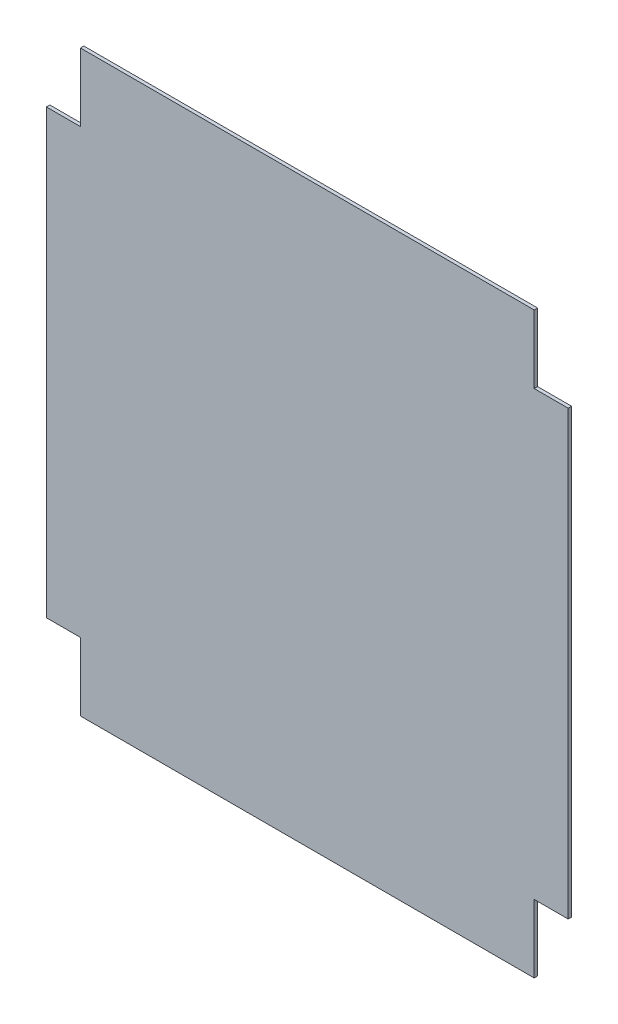
ISO-10303-21;
HEADER;
FILE_DESCRIPTION(('STEP AP214'),'2;1');
FILE_NAME('part.step','',(''),(''),'','','');
FILE_SCHEMA(('AUTOMOTIVE_DESIGN { 1 0 10303 214 1 1 1 1 }'));
ENDSEC;
DATA;
#1=APPLICATION_CONTEXT('core data for automotive mechanical design processes');
#2=APPLICATION_PROTOCOL_DEFINITION('international standard','automotive_design',2000,#1);
#3=PRODUCT_CONTEXT('',#1,'mechanical');
#4=PRODUCT('Part','Part','',(#3));
#5=PRODUCT_RELATED_PRODUCT_CATEGORY('part','',(#4));
#6=PRODUCT_DEFINITION_FORMATION('','',#4);
#7=PRODUCT_DEFINITION_CONTEXT('part definition',#1,'design');
#8=PRODUCT_DEFINITION('design','',#6,#7);
#9=PRODUCT_DEFINITION_SHAPE('','',#8);
#10=(LENGTH_UNIT() NAMED_UNIT(*) SI_UNIT(.MILLI.,.METRE.));
#11=(NAMED_UNIT(*) PLANE_ANGLE_UNIT() SI_UNIT($,.RADIAN.));
#12=(NAMED_UNIT(*) SI_UNIT($,.STERADIAN.) SOLID_ANGLE_UNIT());
#13=UNCERTAINTY_MEASURE_WITH_UNIT(LENGTH_MEASURE(1.E-05),#10,'distance_accuracy_value','');
#14=(GEOMETRIC_REPRESENTATION_CONTEXT(3) GLOBAL_UNCERTAINTY_ASSIGNED_CONTEXT((#13)) GLOBAL_UNIT_ASSIGNED_CONTEXT((#10,
#11,#12)) REPRESENTATION_CONTEXT('',''));
#15=CARTESIAN_POINT('',(0.,0.,0.));
#16=DIRECTION('',(0.,0.,1.));
#17=DIRECTION('',(1.,0.,0.));
#18=AXIS2_PLACEMENT_3D('',#15,#16,#17);
#19=CARTESIAN_POINT('',(430.,51.2163483201847,3.));
#20=DIRECTION('',(0.,1.,0.));
#21=DIRECTION('',(-1.,0.,0.));
#22=AXIS2_PLACEMENT_3D('',#19,#20,#21);
#23=PLANE('',#22);
#24=DIRECTION('',(1.,0.,0.));
#25=VECTOR('',#24,1.);
#26=CARTESIAN_POINT('',(430.,51.2163483201847,0.));
#27=LINE('',#26,#25);
#28=CARTESIAN_POINT('',(30.,51.2163483201846,0.));
#29=VERTEX_POINT('',#28);
#30=CARTESIAN_POINT('',(430.,51.2163483201847,0.));
#31=VERTEX_POINT('',#30);
#32=EDGE_CURVE('E153',#29,#31,#27,.T.);
#33=ORIENTED_EDGE('',*,*,#32,.T.);
#34=DIRECTION('',(0.,0.,-1.));
#35=VECTOR('',#34,1.);
#36=CARTESIAN_POINT('',(430.,51.2163483201847,3.));
#37=LINE('',#36,#35);
#38=CARTESIAN_POINT('',(430.,51.2163483201847,3.));
#39=VERTEX_POINT('',#38);
#40=EDGE_CURVE('E11',#39,#31,#37,.T.);
#41=ORIENTED_EDGE('',*,*,#40,.F.);
#42=DIRECTION('',(1.,0.,0.));
#43=VECTOR('',#42,1.);
#44=CARTESIAN_POINT('',(430.,51.2163483201847,3.));
#45=LINE('',#44,#43);
#46=CARTESIAN_POINT('',(30.,51.2163483201846,3.));
#47=VERTEX_POINT('',#46);
#48=EDGE_CURVE('E175',#47,#39,#45,.T.);
#49=ORIENTED_EDGE('',*,*,#48,.F.);
#50=DIRECTION('',(0.,0.,-1.));
#51=VECTOR('',#50,1.);
#52=CARTESIAN_POINT('',(30.,51.2163483201846,3.));
#53=LINE('',#52,#51);
#54=EDGE_CURVE('E149',#47,#29,#53,.T.);
#55=ORIENTED_EDGE('',*,*,#54,.T.);
#56=EDGE_LOOP('',(#33,#41,#49,#55));
#57=FACE_BOUND('',#56,.T.);
#58=ADVANCED_FACE('F33',(#57),#23,.F.);
#59=CARTESIAN_POINT('',(430.,111.216348320184,3.));
#60=DIRECTION('',(-1.,0.,0.));
#61=DIRECTION('',(0.,-1.,0.));
#62=AXIS2_PLACEMENT_3D('',#59,#60,#61);
#63=PLANE('',#62);
#64=DIRECTION('',(0.,1.,0.));
#65=VECTOR('',#64,1.);
#66=CARTESIAN_POINT('',(430.,111.216348320184,0.));
#67=LINE('',#66,#65);
#68=CARTESIAN_POINT('',(430.,111.216348320184,0.));
#69=VERTEX_POINT('',#68);
#70=EDGE_CURVE('E156',#31,#69,#67,.T.);
#71=ORIENTED_EDGE('',*,*,#70,.T.);
#72=DIRECTION('',(0.,0.,-1.));
#73=VECTOR('',#72,1.);
#74=CARTESIAN_POINT('',(430.,111.216348320184,3.));
#75=LINE('',#74,#73);
#76=CARTESIAN_POINT('',(430.,111.216348320184,3.));
#77=VERTEX_POINT('',#76);
#78=EDGE_CURVE('E41',#77,#69,#75,.T.);
#79=ORIENTED_EDGE('',*,*,#78,.F.);
#80=DIRECTION('',(0.,1.,0.));
#81=VECTOR('',#80,1.);
#82=CARTESIAN_POINT('',(430.,111.216348320184,3.));
#83=LINE('',#82,#81);
#84=EDGE_CURVE('E104',#39,#77,#83,.T.);
#85=ORIENTED_EDGE('',*,*,#84,.F.);
#86=ORIENTED_EDGE('',*,*,#40,.T.);
#87=EDGE_LOOP('',(#71,#79,#85,#86));
#88=FACE_BOUND('',#87,.T.);
#89=ADVANCED_FACE('F253',(#88),#63,.F.);
#90=CARTESIAN_POINT('',(460.,111.216348320185,3.));
#91=DIRECTION('',(0.,1.,0.));
#92=DIRECTION('',(-1.,0.,0.));
#93=AXIS2_PLACEMENT_3D('',#90,#91,#92);
#94=PLANE('',#93);
#95=DIRECTION('',(1.,0.,0.));
#96=VECTOR('',#95,1.);
#97=CARTESIAN_POINT('',(460.,111.216348320185,0.));
#98=LINE('',#97,#96);
#99=CARTESIAN_POINT('',(460.,111.216348320185,0.));
#100=VERTEX_POINT('',#99);
#101=EDGE_CURVE('E158',#69,#100,#98,.T.);
#102=ORIENTED_EDGE('',*,*,#101,.T.);
#103=DIRECTION('',(0.,0.,-1.));
#104=VECTOR('',#103,1.);
#105=CARTESIAN_POINT('',(460.,111.216348320185,3.));
#106=LINE('',#105,#104);
#107=CARTESIAN_POINT('',(460.,111.216348320185,3.));
#108=VERTEX_POINT('',#107);
#109=EDGE_CURVE('E194',#108,#100,#106,.T.);
#110=ORIENTED_EDGE('',*,*,#109,.F.);
#111=DIRECTION('',(1.,0.,0.));
#112=VECTOR('',#111,1.);
#113=CARTESIAN_POINT('',(460.,111.216348320185,3.));
#114=LINE('',#113,#112);
#115=EDGE_CURVE('E202',#77,#108,#114,.T.);
#116=ORIENTED_EDGE('',*,*,#115,.F.);
#117=ORIENTED_EDGE('',*,*,#78,.T.);
#118=EDGE_LOOP('',(#102,#110,#116,#117));
#119=FACE_BOUND('',#118,.T.);
#120=ADVANCED_FACE('F200',(#119),#94,.F.);
#121=CARTESIAN_POINT('',(460.,501.216348320185,3.));
#122=DIRECTION('',(-1.,0.,0.));
#123=DIRECTION('',(0.,-1.,0.));
#124=AXIS2_PLACEMENT_3D('',#121,#122,#123);
#125=PLANE('',#124);
#126=DIRECTION('',(0.,1.,0.));
#127=VECTOR('',#126,1.);
#128=CARTESIAN_POINT('',(460.,501.216348320185,0.));
#129=LINE('',#128,#127);
#130=CARTESIAN_POINT('',(460.,501.216348320185,0.));
#131=VERTEX_POINT('',#130);
#132=EDGE_CURVE('E160',#100,#131,#129,.T.);
#133=ORIENTED_EDGE('',*,*,#132,.T.);
#134=DIRECTION('',(0.,0.,-1.));
#135=VECTOR('',#134,1.);
#136=CARTESIAN_POINT('',(460.,501.216348320185,3.));
#137=LINE('',#136,#135);
#138=CARTESIAN_POINT('',(460.,501.216348320185,3.));
#139=VERTEX_POINT('',#138);
#140=EDGE_CURVE('E191',#139,#131,#137,.T.);
#141=ORIENTED_EDGE('',*,*,#140,.F.);
#142=DIRECTION('',(0.,1.,0.));
#143=VECTOR('',#142,1.);
#144=CARTESIAN_POINT('',(460.,501.216348320185,3.));
#145=LINE('',#144,#143);
#146=EDGE_CURVE('E220',#108,#139,#145,.T.);
#147=ORIENTED_EDGE('',*,*,#146,.F.);
#148=ORIENTED_EDGE('',*,*,#109,.T.);
#149=EDGE_LOOP('',(#133,#141,#147,#148));
#150=FACE_BOUND('',#149,.T.);
#151=ADVANCED_FACE('F211',(#150),#125,.F.);
#152=CARTESIAN_POINT('',(430.,501.216348320185,3.));
#153=DIRECTION('',(0.,-1.,0.));
#154=DIRECTION('',(1.,0.,0.));
#155=AXIS2_PLACEMENT_3D('',#152,#153,#154);
#156=PLANE('',#155);
#157=DIRECTION('',(-1.,0.,0.));
#158=VECTOR('',#157,1.);
#159=CARTESIAN_POINT('',(430.,501.216348320185,0.));
#160=LINE('',#159,#158);
#161=CARTESIAN_POINT('',(430.,501.216348320185,0.));
#162=VERTEX_POINT('',#161);
#163=EDGE_CURVE('E162',#131,#162,#160,.T.);
#164=ORIENTED_EDGE('',*,*,#163,.T.);
#165=DIRECTION('',(0.,0.,-1.));
#166=VECTOR('',#165,1.);
#167=CARTESIAN_POINT('',(430.,501.216348320185,3.));
#168=LINE('',#167,#166);
#169=CARTESIAN_POINT('',(430.,501.216348320185,3.));
#170=VERTEX_POINT('',#169);
#171=EDGE_CURVE('E188',#170,#162,#168,.T.);
#172=ORIENTED_EDGE('',*,*,#171,.F.);
#173=DIRECTION('',(-1.,0.,0.));
#174=VECTOR('',#173,1.);
#175=CARTESIAN_POINT('',(430.,501.216348320185,3.));
#176=LINE('',#175,#174);
#177=EDGE_CURVE('E217',#139,#170,#176,.T.);
#178=ORIENTED_EDGE('',*,*,#177,.F.);
#179=ORIENTED_EDGE('',*,*,#140,.T.);
#180=EDGE_LOOP('',(#164,#172,#178,#179));
#181=FACE_BOUND('',#180,.T.);
#182=ADVANCED_FACE('F215',(#181),#156,.F.);
#183=CARTESIAN_POINT('',(430.,561.216348320185,3.));
#184=DIRECTION('',(-1.,0.,0.));
#185=DIRECTION('',(0.,0.,1.));
#186=AXIS2_PLACEMENT_3D('',#183,#184,#185);
#187=PLANE('',#186);
#188=DIRECTION('',(0.,1.,0.));
#189=VECTOR('',#188,1.);
#190=CARTESIAN_POINT('',(430.,561.216348320185,0.));
#191=LINE('',#190,#189);
#192=CARTESIAN_POINT('',(430.,561.216348320185,0.));
#193=VERTEX_POINT('',#192);
#194=EDGE_CURVE('E164',#162,#193,#191,.T.);
#195=ORIENTED_EDGE('',*,*,#194,.T.);
#196=DIRECTION('',(0.,0.,-1.));
#197=VECTOR('',#196,1.);
#198=CARTESIAN_POINT('',(430.,561.216348320185,3.));
#199=LINE('',#198,#197);
#200=CARTESIAN_POINT('',(430.,561.216348320185,3.));
#201=VERTEX_POINT('',#200);
#202=EDGE_CURVE('E185',#201,#193,#199,.T.);
#203=ORIENTED_EDGE('',*,*,#202,.F.);
#204=DIRECTION('',(0.,1.,0.));
#205=VECTOR('',#204,1.);
#206=CARTESIAN_POINT('',(430.,561.216348320185,3.));
#207=LINE('',#206,#205);
#208=EDGE_CURVE('E219',#170,#201,#207,.T.);
#209=ORIENTED_EDGE('',*,*,#208,.F.);
#210=ORIENTED_EDGE('',*,*,#171,.T.);
#211=EDGE_LOOP('',(#195,#203,#209,#210));
#212=FACE_BOUND('',#211,.T.);
#213=ADVANCED_FACE('F266',(#212),#187,.F.);
#214=CARTESIAN_POINT('',(29.9999999999999,561.216348320185,3.));
#215=DIRECTION('',(0.,-1.,0.));
#216=DIRECTION('',(0.,0.,-1.));
#217=AXIS2_PLACEMENT_3D('',#214,#215,#216);
#218=PLANE('',#217);
#219=DIRECTION('',(-1.,0.,0.));
#220=VECTOR('',#219,1.);
#221=CARTESIAN_POINT('',(29.9999999999999,561.216348320185,0.));
#222=LINE('',#221,#220);
#223=CARTESIAN_POINT('',(29.9999999999999,561.216348320185,0.));
#224=VERTEX_POINT('',#223);
#225=EDGE_CURVE('E166',#193,#224,#222,.T.);
#226=ORIENTED_EDGE('',*,*,#225,.T.);
#227=DIRECTION('',(0.,0.,-1.));
#228=VECTOR('',#227,1.);
#229=CARTESIAN_POINT('',(29.9999999999999,561.216348320185,3.));
#230=LINE('',#229,#228);
#231=CARTESIAN_POINT('',(29.9999999999999,561.216348320185,3.));
#232=VERTEX_POINT('',#231);
#233=EDGE_CURVE('E182',#232,#224,#230,.T.);
#234=ORIENTED_EDGE('',*,*,#233,.F.);
#235=DIRECTION('',(-1.,0.,0.));
#236=VECTOR('',#235,1.);
#237=CARTESIAN_POINT('',(29.9999999999999,561.216348320185,3.));
#238=LINE('',#237,#236);
#239=EDGE_CURVE('E222',#201,#232,#238,.T.);
#240=ORIENTED_EDGE('',*,*,#239,.F.);
#241=ORIENTED_EDGE('',*,*,#202,.T.);
#242=EDGE_LOOP('',(#226,#234,#240,#241));
#243=FACE_BOUND('',#242,.T.);
#244=ADVANCED_FACE('F269',(#243),#218,.F.);
#245=CARTESIAN_POINT('',(29.9999999999999,501.216348320185,3.));
#246=DIRECTION('',(1.,0.,0.));
#247=DIRECTION('',(0.,0.,-1.));
#248=AXIS2_PLACEMENT_3D('',#245,#246,#247);
#249=PLANE('',#248);
#250=DIRECTION('',(0.,-1.,0.));
#251=VECTOR('',#250,1.);
#252=CARTESIAN_POINT('',(29.9999999999999,501.216348320185,0.));
#253=LINE('',#252,#251);
#254=CARTESIAN_POINT('',(29.9999999999999,501.216348320185,0.));
#255=VERTEX_POINT('',#254);
#256=EDGE_CURVE('E168',#224,#255,#253,.T.);
#257=ORIENTED_EDGE('',*,*,#256,.T.);
#258=DIRECTION('',(0.,0.,-1.));
#259=VECTOR('',#258,1.);
#260=CARTESIAN_POINT('',(29.9999999999999,501.216348320185,3.));
#261=LINE('',#260,#259);
#262=CARTESIAN_POINT('',(29.9999999999999,501.216348320185,3.));
#263=VERTEX_POINT('',#262);
#264=EDGE_CURVE('E179',#263,#255,#261,.T.);
#265=ORIENTED_EDGE('',*,*,#264,.F.);
#266=DIRECTION('',(0.,-1.,0.));
#267=VECTOR('',#266,1.);
#268=CARTESIAN_POINT('',(29.9999999999999,501.216348320185,3.));
#269=LINE('',#268,#267);
#270=EDGE_CURVE('E228',#232,#263,#269,.T.);
#271=ORIENTED_EDGE('',*,*,#270,.F.);
#272=ORIENTED_EDGE('',*,*,#233,.T.);
#273=EDGE_LOOP('',(#257,#265,#271,#272));
#274=FACE_BOUND('',#273,.T.);
#275=ADVANCED_FACE('F234',(#274),#249,.F.);
#276=CARTESIAN_POINT('',(0.,501.216348320185,3.));
#277=DIRECTION('',(0.,-1.,0.));
#278=DIRECTION('',(0.,0.,-1.));
#279=AXIS2_PLACEMENT_3D('',#276,#277,#278);
#280=PLANE('',#279);
#281=DIRECTION('',(-1.,0.,0.));
#282=VECTOR('',#281,1.);
#283=CARTESIAN_POINT('',(0.,501.216348320185,0.));
#284=LINE('',#283,#282);
#285=CARTESIAN_POINT('',(0.,501.216348320185,0.));
#286=VERTEX_POINT('',#285);
#287=EDGE_CURVE('E170',#255,#286,#284,.T.);
#288=ORIENTED_EDGE('',*,*,#287,.T.);
#289=DIRECTION('',(0.,0.,-1.));
#290=VECTOR('',#289,1.);
#291=CARTESIAN_POINT('',(0.,501.216348320185,3.));
#292=LINE('',#291,#290);
#293=CARTESIAN_POINT('',(0.,501.216348320185,3.));
#294=VERTEX_POINT('',#293);
#295=EDGE_CURVE('E144',#294,#286,#292,.T.);
#296=ORIENTED_EDGE('',*,*,#295,.F.);
#297=DIRECTION('',(-1.,0.,0.));
#298=VECTOR('',#297,1.);
#299=CARTESIAN_POINT('',(0.,501.216348320185,3.));
#300=LINE('',#299,#298);
#301=EDGE_CURVE('E135',#263,#294,#300,.T.);
#302=ORIENTED_EDGE('',*,*,#301,.F.);
#303=ORIENTED_EDGE('',*,*,#264,.T.);
#304=EDGE_LOOP('',(#288,#296,#302,#303));
#305=FACE_BOUND('',#304,.T.);
#306=ADVANCED_FACE('F238',(#305),#280,.F.);
#307=CARTESIAN_POINT('',(0.,111.216348320184,3.));
#308=DIRECTION('',(1.,0.,0.));
#309=DIRECTION('',(0.,1.,0.));
#310=AXIS2_PLACEMENT_3D('',#307,#308,#309);
#311=PLANE('',#310);
#312=DIRECTION('',(0.,-1.,0.));
#313=VECTOR('',#312,1.);
#314=CARTESIAN_POINT('',(0.,111.216348320184,0.));
#315=LINE('',#314,#313);
#316=CARTESIAN_POINT('',(0.,111.216348320184,0.));
#317=VERTEX_POINT('',#316);
#318=EDGE_CURVE('E143',#286,#317,#315,.T.);
#319=ORIENTED_EDGE('',*,*,#318,.T.);
#320=DIRECTION('',(0.,0.,-1.));
#321=VECTOR('',#320,1.);
#322=CARTESIAN_POINT('',(0.,111.216348320184,3.));
#323=LINE('',#322,#321);
#324=CARTESIAN_POINT('',(0.,111.216348320184,3.));
#325=VERTEX_POINT('',#324);
#326=EDGE_CURVE('E140',#325,#317,#323,.T.);
#327=ORIENTED_EDGE('',*,*,#326,.F.);
#328=DIRECTION('',(0.,-1.,0.));
#329=VECTOR('',#328,1.);
#330=CARTESIAN_POINT('',(0.,111.216348320184,3.));
#331=LINE('',#330,#329);
#332=EDGE_CURVE('E129',#294,#325,#331,.T.);
#333=ORIENTED_EDGE('',*,*,#332,.F.);
#334=ORIENTED_EDGE('',*,*,#295,.T.);
#335=EDGE_LOOP('',(#319,#327,#333,#334));
#336=FACE_BOUND('',#335,.T.);
#337=ADVANCED_FACE('F141',(#336),#311,.F.);
#338=CARTESIAN_POINT('',(30.,111.216348320184,3.));
#339=DIRECTION('',(0.,1.,0.));
#340=DIRECTION('',(-1.,0.,0.));
#341=AXIS2_PLACEMENT_3D('',#338,#339,#340);
#342=PLANE('',#341);
#343=DIRECTION('',(1.,0.,0.));
#344=VECTOR('',#343,1.);
#345=CARTESIAN_POINT('',(30.,111.216348320184,0.));
#346=LINE('',#345,#344);
#347=CARTESIAN_POINT('',(30.,111.216348320184,0.));
#348=VERTEX_POINT('',#347);
#349=EDGE_CURVE('E90',#317,#348,#346,.T.);
#350=ORIENTED_EDGE('',*,*,#349,.T.);
#351=DIRECTION('',(0.,0.,-1.));
#352=VECTOR('',#351,1.);
#353=CARTESIAN_POINT('',(30.,111.216348320184,3.));
#354=LINE('',#353,#352);
#355=CARTESIAN_POINT('',(30.,111.216348320184,3.));
#356=VERTEX_POINT('',#355);
#357=EDGE_CURVE('E145',#356,#348,#354,.T.);
#358=ORIENTED_EDGE('',*,*,#357,.F.);
#359=DIRECTION('',(1.,0.,0.));
#360=VECTOR('',#359,1.);
#361=CARTESIAN_POINT('',(30.,111.216348320184,3.));
#362=LINE('',#361,#360);
#363=EDGE_CURVE('E133',#325,#356,#362,.T.);
#364=ORIENTED_EDGE('',*,*,#363,.F.);
#365=ORIENTED_EDGE('',*,*,#326,.T.);
#366=EDGE_LOOP('',(#350,#358,#364,#365));
#367=FACE_BOUND('',#366,.T.);
#368=ADVANCED_FACE('F147',(#367),#342,.F.);
#369=CARTESIAN_POINT('',(30.,51.2163483201846,3.));
#370=DIRECTION('',(1.,0.,0.));
#371=DIRECTION('',(0.,1.,0.));
#372=AXIS2_PLACEMENT_3D('',#369,#370,#371);
#373=PLANE('',#372);
#374=DIRECTION('',(0.,-1.,0.));
#375=VECTOR('',#374,1.);
#376=CARTESIAN_POINT('',(30.,51.2163483201846,0.));
#377=LINE('',#376,#375);
#378=EDGE_CURVE('E96',#348,#29,#377,.T.);
#379=ORIENTED_EDGE('',*,*,#378,.T.);
#380=ORIENTED_EDGE('',*,*,#54,.F.);
#381=DIRECTION('',(0.,-1.,0.));
#382=VECTOR('',#381,1.);
#383=CARTESIAN_POINT('',(30.,51.2163483201846,3.));
#384=LINE('',#383,#382);
#385=EDGE_CURVE('E49',#356,#47,#384,.T.);
#386=ORIENTED_EDGE('',*,*,#385,.F.);
#387=ORIENTED_EDGE('',*,*,#357,.T.);
#388=EDGE_LOOP('',(#379,#380,#386,#387));
#389=FACE_BOUND('',#388,.T.);
#390=ADVANCED_FACE('F242',(#389),#373,.F.);
#391=CARTESIAN_POINT('',(0.,0.,3.));
#392=DIRECTION('',(0.,0.,-1.));
#393=DIRECTION('',(-1.,0.,0.));
#394=AXIS2_PLACEMENT_3D('',#391,#392,#393);
#395=PLANE('',#394);
#396=ORIENTED_EDGE('',*,*,#48,.T.);
#397=ORIENTED_EDGE('',*,*,#84,.T.);
#398=ORIENTED_EDGE('',*,*,#115,.T.);
#399=ORIENTED_EDGE('',*,*,#146,.T.);
#400=ORIENTED_EDGE('',*,*,#177,.T.);
#401=ORIENTED_EDGE('',*,*,#208,.T.);
#402=ORIENTED_EDGE('',*,*,#239,.T.);
#403=ORIENTED_EDGE('',*,*,#270,.T.);
#404=ORIENTED_EDGE('',*,*,#301,.T.);
#405=ORIENTED_EDGE('',*,*,#332,.T.);
#406=ORIENTED_EDGE('',*,*,#363,.T.);
#407=ORIENTED_EDGE('',*,*,#385,.T.);
#408=EDGE_LOOP('',(#396,#397,#398,#399,#400,#401,#402,#403,#404,#405,#406,#407));
#409=FACE_BOUND('',#408,.T.);
#410=ADVANCED_FACE('F131',(#409),#395,.F.);
#411=CARTESIAN_POINT('',(0.,0.,0.));
#412=DIRECTION('',(0.,0.,-1.));
#413=DIRECTION('',(-1.,0.,0.));
#414=AXIS2_PLACEMENT_3D('',#411,#412,#413);
#415=PLANE('',#414);
#416=ORIENTED_EDGE('',*,*,#32,.F.);
#417=ORIENTED_EDGE('',*,*,#378,.F.);
#418=ORIENTED_EDGE('',*,*,#349,.F.);
#419=ORIENTED_EDGE('',*,*,#318,.F.);
#420=ORIENTED_EDGE('',*,*,#287,.F.);
#421=ORIENTED_EDGE('',*,*,#256,.F.);
#422=ORIENTED_EDGE('',*,*,#225,.F.);
#423=ORIENTED_EDGE('',*,*,#194,.F.);
#424=ORIENTED_EDGE('',*,*,#163,.F.);
#425=ORIENTED_EDGE('',*,*,#132,.F.);
#426=ORIENTED_EDGE('',*,*,#101,.F.);
#427=ORIENTED_EDGE('',*,*,#70,.F.);
#428=EDGE_LOOP('',(#416,#417,#418,#419,#420,#421,#422,#423,#424,#425,#426,#427));
#429=FACE_BOUND('',#428,.T.);
#430=ADVANCED_FACE('F206',(#429),#415,.T.);
#431=CLOSED_SHELL('',(#58,#89,#120,#151,#182,#213,#244,#275,#306,#337,#368,#390,#410,#430));
#432=MANIFOLD_SOLID_BREP('B2',#431);
#433=ADVANCED_BREP_SHAPE_REPRESENTATION('',(#18,#432),#14);
#434=SHAPE_DEFINITION_REPRESENTATION(#9,#433);
ENDSEC;
END-ISO-10303-21;
